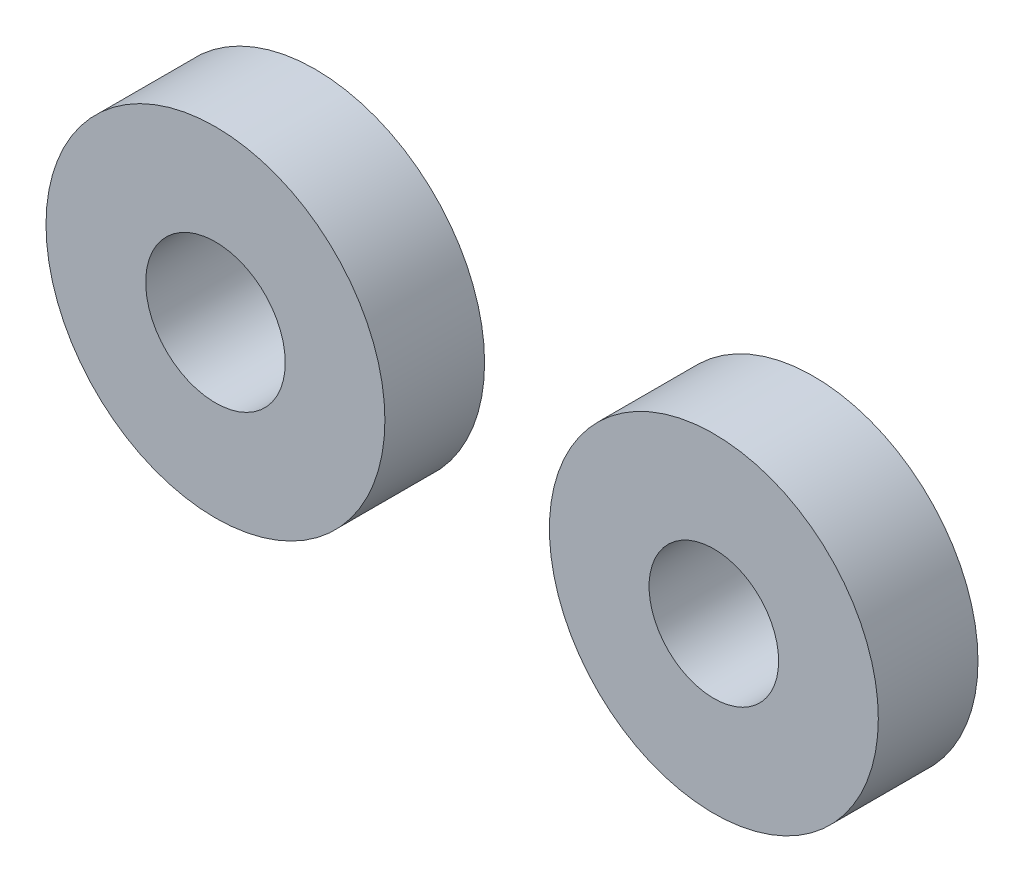
ISO-10303-21;
HEADER;
FILE_DESCRIPTION(('STEP AP214'),'2;1');
FILE_NAME('part.step','',(''),(''),'','','');
FILE_SCHEMA(('AUTOMOTIVE_DESIGN { 1 0 10303 214 1 1 1 1 }'));
ENDSEC;
DATA;
#1=APPLICATION_CONTEXT('core data for automotive mechanical design processes');
#2=APPLICATION_PROTOCOL_DEFINITION('international standard','automotive_design',2000,#1);
#3=PRODUCT_CONTEXT('',#1,'mechanical');
#4=PRODUCT('Part','Part','',(#3));
#5=PRODUCT_RELATED_PRODUCT_CATEGORY('part','',(#4));
#6=PRODUCT_DEFINITION_FORMATION('','',#4);
#7=PRODUCT_DEFINITION_CONTEXT('part definition',#1,'design');
#8=PRODUCT_DEFINITION('design','',#6,#7);
#9=PRODUCT_DEFINITION_SHAPE('','',#8);
#10=(LENGTH_UNIT() NAMED_UNIT(*) SI_UNIT(.MILLI.,.METRE.));
#11=(NAMED_UNIT(*) PLANE_ANGLE_UNIT() SI_UNIT($,.RADIAN.));
#12=(NAMED_UNIT(*) SI_UNIT($,.STERADIAN.) SOLID_ANGLE_UNIT());
#13=UNCERTAINTY_MEASURE_WITH_UNIT(LENGTH_MEASURE(1.E-05),#10,'distance_accuracy_value','');
#14=(GEOMETRIC_REPRESENTATION_CONTEXT(3) GLOBAL_UNCERTAINTY_ASSIGNED_CONTEXT((#13)) GLOBAL_UNIT_ASSIGNED_CONTEXT((#10,
#11,#12)) REPRESENTATION_CONTEXT('',''));
#15=CARTESIAN_POINT('',(0.,0.,0.));
#16=DIRECTION('',(0.,0.,1.));
#17=DIRECTION('',(1.,0.,0.));
#18=AXIS2_PLACEMENT_3D('',#15,#16,#17);
#19=CARTESIAN_POINT('',(12.7,-0.298823529411764,2.54));
#20=DIRECTION('',(0.,0.,1.));
#21=DIRECTION('',(1.,0.,0.));
#22=AXIS2_PLACEMENT_3D('',#19,#20,#21);
#23=PLANE('',#22);
#24=CARTESIAN_POINT('',(12.7,-0.298823529411764,2.54));
#25=DIRECTION('',(0.,0.,1.));
#26=DIRECTION('',(1.,0.,0.));
#27=AXIS2_PLACEMENT_3D('',#24,#25,#26);
#28=CIRCLE('',#27,4.191);
#29=CARTESIAN_POINT('',(16.891,-0.298823529411764,2.54));
#30=VERTEX_POINT('',#29);
#31=EDGE_CURVE('E11',#30,#30,#28,.T.);
#32=ORIENTED_EDGE('',*,*,#31,.T.);
#33=EDGE_LOOP('',(#32));
#34=FACE_BOUND('',#33,.T.);
#35=CARTESIAN_POINT('',(12.7,-0.298823529411764,2.54));
#36=DIRECTION('',(0.,0.,1.));
#37=DIRECTION('',(1.,0.,0.));
#38=AXIS2_PLACEMENT_3D('',#35,#36,#37);
#39=CIRCLE('',#38,1.651);
#40=CARTESIAN_POINT('',(14.351,-0.298823529411764,2.54));
#41=VERTEX_POINT('',#40);
#42=EDGE_CURVE('E56',#41,#41,#39,.T.);
#43=ORIENTED_EDGE('',*,*,#42,.F.);
#44=EDGE_LOOP('',(#43));
#45=FACE_BOUND('',#44,.T.);
#46=ADVANCED_FACE('F45',(#34,#45),#23,.T.);
#47=CARTESIAN_POINT('',(12.7,-0.298823529411764,0.));
#48=DIRECTION('',(0.,0.,1.));
#49=DIRECTION('',(1.,0.,0.));
#50=AXIS2_PLACEMENT_3D('',#47,#48,#49);
#51=PLANE('',#50);
#52=CARTESIAN_POINT('',(12.7,-0.298823529411764,0.));
#53=DIRECTION('',(0.,0.,1.));
#54=DIRECTION('',(1.,0.,0.));
#55=AXIS2_PLACEMENT_3D('',#52,#53,#54);
#56=CIRCLE('',#55,4.191);
#57=CARTESIAN_POINT('',(16.891,-0.298823529411764,0.));
#58=VERTEX_POINT('',#57);
#59=EDGE_CURVE('E49',#58,#58,#56,.T.);
#60=ORIENTED_EDGE('',*,*,#59,.F.);
#61=EDGE_LOOP('',(#60));
#62=FACE_BOUND('',#61,.T.);
#63=CARTESIAN_POINT('',(12.7,-0.298823529411764,0.));
#64=DIRECTION('',(0.,0.,1.));
#65=DIRECTION('',(1.,0.,0.));
#66=AXIS2_PLACEMENT_3D('',#63,#64,#65);
#67=CIRCLE('',#66,1.651);
#68=CARTESIAN_POINT('',(14.351,-0.298823529411764,0.));
#69=VERTEX_POINT('',#68);
#70=EDGE_CURVE('E58',#69,#69,#67,.T.);
#71=ORIENTED_EDGE('',*,*,#70,.T.);
#72=EDGE_LOOP('',(#71));
#73=FACE_BOUND('',#72,.T.);
#74=ADVANCED_FACE('F68',(#62,#73),#51,.F.);
#75=CARTESIAN_POINT('',(12.7,-0.298823529411764,2.54));
#76=DIRECTION('',(0.,0.,-1.));
#77=DIRECTION('',(-1.,0.,0.));
#78=AXIS2_PLACEMENT_3D('',#75,#76,#77);
#79=CYLINDRICAL_SURFACE('',#78,4.191);
#80=ORIENTED_EDGE('',*,*,#31,.F.);
#81=EDGE_LOOP('',(#80));
#82=FACE_BOUND('',#81,.T.);
#83=ORIENTED_EDGE('',*,*,#59,.T.);
#84=EDGE_LOOP('',(#83));
#85=FACE_BOUND('',#84,.T.);
#86=ADVANCED_FACE('F47',(#82,#85),#79,.T.);
#87=CARTESIAN_POINT('',(12.7,-0.298823529411764,2.54));
#88=DIRECTION('',(0.,0.,-1.));
#89=DIRECTION('',(-1.,0.,0.));
#90=AXIS2_PLACEMENT_3D('',#87,#88,#89);
#91=CYLINDRICAL_SURFACE('',#90,1.651);
#92=ORIENTED_EDGE('',*,*,#42,.T.);
#93=EDGE_LOOP('',(#92));
#94=FACE_BOUND('',#93,.T.);
#95=ORIENTED_EDGE('',*,*,#70,.F.);
#96=EDGE_LOOP('',(#95));
#97=FACE_BOUND('',#96,.T.);
#98=ADVANCED_FACE('F64',(#94,#97),#91,.F.);
#99=CLOSED_SHELL('',(#46,#74,#86,#98));
#100=MANIFOLD_SOLID_BREP('B2',#99);
#101=CARTESIAN_POINT('',(0.,0.,2.54));
#102=DIRECTION('',(0.,0.,1.));
#103=DIRECTION('',(1.,0.,0.));
#104=AXIS2_PLACEMENT_3D('',#101,#102,#103);
#105=PLANE('',#104);
#106=CARTESIAN_POINT('',(0.,0.,2.54));
#107=DIRECTION('',(0.,0.,1.));
#108=DIRECTION('',(1.,0.,0.));
#109=AXIS2_PLACEMENT_3D('',#106,#107,#108);
#110=CIRCLE('',#109,4.318);
#111=CARTESIAN_POINT('',(4.318,0.,2.54));
#112=VERTEX_POINT('',#111);
#113=EDGE_CURVE('E44',#112,#112,#110,.T.);
#114=ORIENTED_EDGE('',*,*,#113,.T.);
#115=EDGE_LOOP('',(#114));
#116=FACE_BOUND('',#115,.T.);
#117=CARTESIAN_POINT('',(0.,0.,2.54));
#118=DIRECTION('',(0.,0.,1.));
#119=DIRECTION('',(1.,0.,0.));
#120=AXIS2_PLACEMENT_3D('',#117,#118,#119);
#121=CIRCLE('',#120,1.778);
#122=CARTESIAN_POINT('',(1.778,0.,2.54));
#123=VERTEX_POINT('',#122);
#124=EDGE_CURVE('E120',#123,#123,#121,.T.);
#125=ORIENTED_EDGE('',*,*,#124,.F.);
#126=EDGE_LOOP('',(#125));
#127=FACE_BOUND('',#126,.T.);
#128=ADVANCED_FACE('F107',(#116,#127),#105,.T.);
#129=CARTESIAN_POINT('',(0.,0.,0.));
#130=DIRECTION('',(0.,0.,1.));
#131=DIRECTION('',(1.,0.,0.));
#132=AXIS2_PLACEMENT_3D('',#129,#130,#131);
#133=PLANE('',#132);
#134=CARTESIAN_POINT('',(0.,0.,0.));
#135=DIRECTION('',(0.,0.,1.));
#136=DIRECTION('',(1.,0.,0.));
#137=AXIS2_PLACEMENT_3D('',#134,#135,#136);
#138=CIRCLE('',#137,4.318);
#139=CARTESIAN_POINT('',(4.318,0.,0.));
#140=VERTEX_POINT('',#139);
#141=EDGE_CURVE('E111',#140,#140,#138,.T.);
#142=ORIENTED_EDGE('',*,*,#141,.F.);
#143=EDGE_LOOP('',(#142));
#144=FACE_BOUND('',#143,.T.);
#145=CARTESIAN_POINT('',(0.,0.,0.));
#146=DIRECTION('',(0.,0.,1.));
#147=DIRECTION('',(1.,0.,0.));
#148=AXIS2_PLACEMENT_3D('',#145,#146,#147);
#149=CIRCLE('',#148,1.778);
#150=CARTESIAN_POINT('',(1.778,0.,0.));
#151=VERTEX_POINT('',#150);
#152=EDGE_CURVE('E122',#151,#151,#149,.T.);
#153=ORIENTED_EDGE('',*,*,#152,.T.);
#154=EDGE_LOOP('',(#153));
#155=FACE_BOUND('',#154,.T.);
#156=ADVANCED_FACE('F134',(#144,#155),#133,.F.);
#157=CARTESIAN_POINT('',(0.,0.,2.54));
#158=DIRECTION('',(0.,0.,-1.));
#159=DIRECTION('',(-1.,0.,0.));
#160=AXIS2_PLACEMENT_3D('',#157,#158,#159);
#161=CYLINDRICAL_SURFACE('',#160,4.318);
#162=ORIENTED_EDGE('',*,*,#113,.F.);
#163=EDGE_LOOP('',(#162));
#164=FACE_BOUND('',#163,.T.);
#165=ORIENTED_EDGE('',*,*,#141,.T.);
#166=EDGE_LOOP('',(#165));
#167=FACE_BOUND('',#166,.T.);
#168=ADVANCED_FACE('F109',(#164,#167),#161,.T.);
#169=CARTESIAN_POINT('',(0.,0.,2.54));
#170=DIRECTION('',(0.,0.,-1.));
#171=DIRECTION('',(-1.,0.,0.));
#172=AXIS2_PLACEMENT_3D('',#169,#170,#171);
#173=CYLINDRICAL_SURFACE('',#172,1.778);
#174=ORIENTED_EDGE('',*,*,#124,.T.);
#175=EDGE_LOOP('',(#174));
#176=FACE_BOUND('',#175,.T.);
#177=ORIENTED_EDGE('',*,*,#152,.F.);
#178=EDGE_LOOP('',(#177));
#179=FACE_BOUND('',#178,.T.);
#180=ADVANCED_FACE('F130',(#176,#179),#173,.F.);
#181=CLOSED_SHELL('',(#128,#156,#168,#180));
#182=MANIFOLD_SOLID_BREP('B6',#181);
#183=ADVANCED_BREP_SHAPE_REPRESENTATION('',(#18,#100,#182),#14);
#184=SHAPE_DEFINITION_REPRESENTATION(#9,#183);
ENDSEC;
END-ISO-10303-21;
